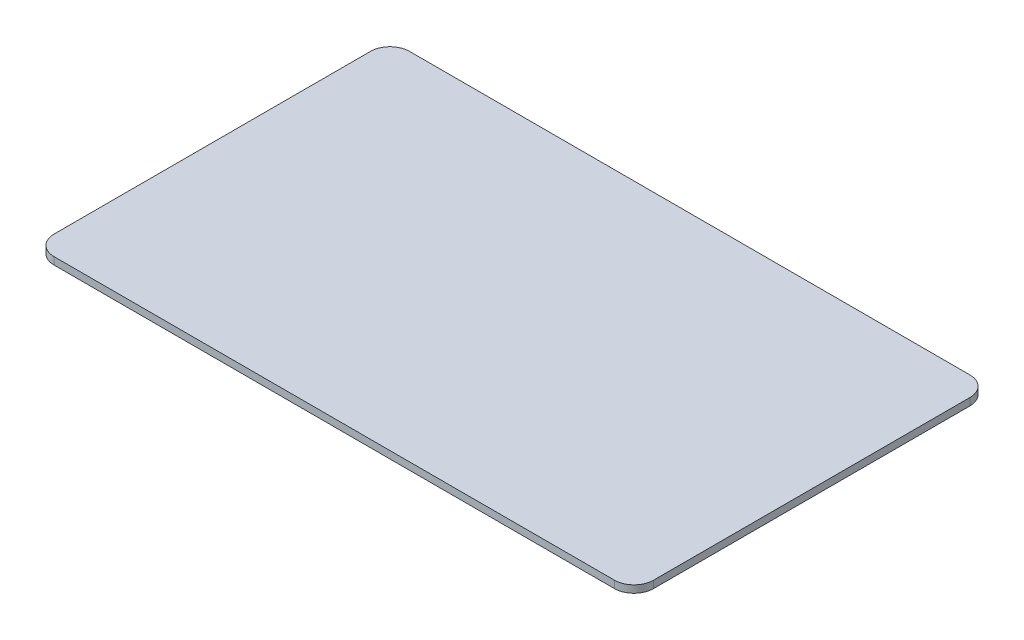
ISO-10303-21;
HEADER;
FILE_DESCRIPTION(('STEP AP214'),'2;1');
FILE_NAME('part.step','',(''),(''),'','','');
FILE_SCHEMA(('AUTOMOTIVE_DESIGN { 1 0 10303 214 1 1 1 1 }'));
ENDSEC;
DATA;
#1=APPLICATION_CONTEXT('core data for automotive mechanical design processes');
#2=APPLICATION_PROTOCOL_DEFINITION('international standard','automotive_design',2000,#1);
#3=PRODUCT_CONTEXT('',#1,'mechanical');
#4=PRODUCT('Part','Part','',(#3));
#5=PRODUCT_RELATED_PRODUCT_CATEGORY('part','',(#4));
#6=PRODUCT_DEFINITION_FORMATION('','',#4);
#7=PRODUCT_DEFINITION_CONTEXT('part definition',#1,'design');
#8=PRODUCT_DEFINITION('design','',#6,#7);
#9=PRODUCT_DEFINITION_SHAPE('','',#8);
#10=(LENGTH_UNIT() NAMED_UNIT(*) SI_UNIT(.MILLI.,.METRE.));
#11=(NAMED_UNIT(*) PLANE_ANGLE_UNIT() SI_UNIT($,.RADIAN.));
#12=(NAMED_UNIT(*) SI_UNIT($,.STERADIAN.) SOLID_ANGLE_UNIT());
#13=UNCERTAINTY_MEASURE_WITH_UNIT(LENGTH_MEASURE(1.E-05),#10,'distance_accuracy_value','');
#14=(GEOMETRIC_REPRESENTATION_CONTEXT(3) GLOBAL_UNCERTAINTY_ASSIGNED_CONTEXT((#13)) GLOBAL_UNIT_ASSIGNED_CONTEXT((#10,
#11,#12)) REPRESENTATION_CONTEXT('',''));
#15=CARTESIAN_POINT('',(0.,0.,0.));
#16=DIRECTION('',(0.,0.,1.));
#17=DIRECTION('',(1.,0.,0.));
#18=AXIS2_PLACEMENT_3D('',#15,#16,#17);
#19=CARTESIAN_POINT('',(-114.85,1.5,64.85));
#20=DIRECTION('',(0.,-1.,0.));
#21=DIRECTION('',(0.,0.,-1.));
#22=AXIS2_PLACEMENT_3D('',#19,#20,#21);
#23=CYLINDRICAL_SURFACE('',#22,7.99999999999999);
#24=CARTESIAN_POINT('',(-114.85,-1.5,64.85));
#25=DIRECTION('',(0.,1.,0.));
#26=DIRECTION('',(0.,0.,-1.));
#27=AXIS2_PLACEMENT_3D('',#24,#25,#26);
#28=CIRCLE('',#27,7.99999999999999);
#29=CARTESIAN_POINT('',(-122.85,-1.5,64.8499999999999));
#30=VERTEX_POINT('',#29);
#31=CARTESIAN_POINT('',(-114.85,-1.5,72.85));
#32=VERTEX_POINT('',#31);
#33=EDGE_CURVE('E129',#30,#32,#28,.T.);
#34=ORIENTED_EDGE('',*,*,#33,.T.);
#35=DIRECTION('',(0.,-1.,0.));
#36=VECTOR('',#35,1.);
#37=CARTESIAN_POINT('',(-114.85,1.5,72.85));
#38=LINE('',#37,#36);
#39=CARTESIAN_POINT('',(-114.85,1.5,72.85));
#40=VERTEX_POINT('',#39);
#41=EDGE_CURVE('E11',#40,#32,#38,.T.);
#42=ORIENTED_EDGE('',*,*,#41,.F.);
#43=CARTESIAN_POINT('',(-114.85,1.5,64.85));
#44=DIRECTION('',(0.,1.,0.));
#45=DIRECTION('',(0.,0.,-1.));
#46=AXIS2_PLACEMENT_3D('',#43,#44,#45);
#47=CIRCLE('',#46,7.99999999999999);
#48=CARTESIAN_POINT('',(-122.85,1.5,64.8499999999999));
#49=VERTEX_POINT('',#48);
#50=EDGE_CURVE('E143',#49,#40,#47,.T.);
#51=ORIENTED_EDGE('',*,*,#50,.F.);
#52=DIRECTION('',(0.,-1.,0.));
#53=VECTOR('',#52,1.);
#54=CARTESIAN_POINT('',(-122.85,1.5,64.8499999999999));
#55=LINE('',#54,#53);
#56=EDGE_CURVE('E125',#49,#30,#55,.T.);
#57=ORIENTED_EDGE('',*,*,#56,.T.);
#58=EDGE_LOOP('',(#34,#42,#51,#57));
#59=FACE_BOUND('',#58,.T.);
#60=ADVANCED_FACE('F33',(#59),#23,.T.);
#61=CARTESIAN_POINT('',(-114.85,1.5,72.85));
#62=DIRECTION('',(0.,0.,-1.));
#63=DIRECTION('',(-1.,0.,0.));
#64=AXIS2_PLACEMENT_3D('',#61,#62,#63);
#65=PLANE('',#64);
#66=DIRECTION('',(1.,0.,0.));
#67=VECTOR('',#66,1.);
#68=CARTESIAN_POINT('',(-114.85,-1.5,72.85));
#69=LINE('',#68,#67);
#70=CARTESIAN_POINT('',(114.85,-1.5,72.85));
#71=VERTEX_POINT('',#70);
#72=EDGE_CURVE('E132',#32,#71,#69,.T.);
#73=ORIENTED_EDGE('',*,*,#72,.T.);
#74=DIRECTION('',(0.,-1.,0.));
#75=VECTOR('',#74,1.);
#76=CARTESIAN_POINT('',(114.85,1.5,72.85));
#77=LINE('',#76,#75);
#78=CARTESIAN_POINT('',(114.85,1.5,72.85));
#79=VERTEX_POINT('',#78);
#80=EDGE_CURVE('E41',#79,#71,#77,.T.);
#81=ORIENTED_EDGE('',*,*,#80,.F.);
#82=DIRECTION('',(1.,0.,0.));
#83=VECTOR('',#82,1.);
#84=CARTESIAN_POINT('',(-114.85,1.5,72.85));
#85=LINE('',#84,#83);
#86=EDGE_CURVE('E92',#40,#79,#85,.T.);
#87=ORIENTED_EDGE('',*,*,#86,.F.);
#88=ORIENTED_EDGE('',*,*,#41,.T.);
#89=EDGE_LOOP('',(#73,#81,#87,#88));
#90=FACE_BOUND('',#89,.T.);
#91=ADVANCED_FACE('F178',(#90),#65,.F.);
#92=CARTESIAN_POINT('',(114.85,1.5,64.85));
#93=DIRECTION('',(0.,-1.,0.));
#94=DIRECTION('',(0.,0.,-1.));
#95=AXIS2_PLACEMENT_3D('',#92,#93,#94);
#96=CYLINDRICAL_SURFACE('',#95,7.99999999999999);
#97=CARTESIAN_POINT('',(114.85,-1.5,64.85));
#98=DIRECTION('',(0.,1.,0.));
#99=DIRECTION('',(0.,0.,1.));
#100=AXIS2_PLACEMENT_3D('',#97,#98,#99);
#101=CIRCLE('',#100,7.99999999999999);
#102=CARTESIAN_POINT('',(122.85,-1.5,64.8499999999999));
#103=VERTEX_POINT('',#102);
#104=EDGE_CURVE('E134',#71,#103,#101,.T.);
#105=ORIENTED_EDGE('',*,*,#104,.T.);
#106=DIRECTION('',(0.,-1.,0.));
#107=VECTOR('',#106,1.);
#108=CARTESIAN_POINT('',(122.85,1.5,64.8499999999999));
#109=LINE('',#108,#107);
#110=CARTESIAN_POINT('',(122.85,1.5,64.8499999999999));
#111=VERTEX_POINT('',#110);
#112=EDGE_CURVE('E150',#111,#103,#109,.T.);
#113=ORIENTED_EDGE('',*,*,#112,.F.);
#114=CARTESIAN_POINT('',(114.85,1.5,64.85));
#115=DIRECTION('',(0.,1.,0.));
#116=DIRECTION('',(0.,0.,1.));
#117=AXIS2_PLACEMENT_3D('',#114,#115,#116);
#118=CIRCLE('',#117,7.99999999999999);
#119=EDGE_CURVE('E158',#79,#111,#118,.T.);
#120=ORIENTED_EDGE('',*,*,#119,.F.);
#121=ORIENTED_EDGE('',*,*,#80,.T.);
#122=EDGE_LOOP('',(#105,#113,#120,#121));
#123=FACE_BOUND('',#122,.T.);
#124=ADVANCED_FACE('F156',(#123),#96,.T.);
#125=CARTESIAN_POINT('',(122.85,1.5,64.8499999999999));
#126=DIRECTION('',(-1.,0.,0.));
#127=DIRECTION('',(0.,0.,1.));
#128=AXIS2_PLACEMENT_3D('',#125,#126,#127);
#129=PLANE('',#128);
#130=DIRECTION('',(0.,0.,-1.));
#131=VECTOR('',#130,1.);
#132=CARTESIAN_POINT('',(122.85,-1.5,64.8499999999999));
#133=LINE('',#132,#131);
#134=CARTESIAN_POINT('',(122.85,-1.5,-64.85));
#135=VERTEX_POINT('',#134);
#136=EDGE_CURVE('E136',#103,#135,#133,.T.);
#137=ORIENTED_EDGE('',*,*,#136,.T.);
#138=DIRECTION('',(0.,-1.,0.));
#139=VECTOR('',#138,1.);
#140=CARTESIAN_POINT('',(122.85,1.5,-64.85));
#141=LINE('',#140,#139);
#142=CARTESIAN_POINT('',(122.85,1.5,-64.85));
#143=VERTEX_POINT('',#142);
#144=EDGE_CURVE('E147',#143,#135,#141,.T.);
#145=ORIENTED_EDGE('',*,*,#144,.F.);
#146=DIRECTION('',(0.,0.,-1.));
#147=VECTOR('',#146,1.);
#148=CARTESIAN_POINT('',(122.85,1.5,64.8499999999999));
#149=LINE('',#148,#147);
#150=EDGE_CURVE('E170',#111,#143,#149,.T.);
#151=ORIENTED_EDGE('',*,*,#150,.F.);
#152=ORIENTED_EDGE('',*,*,#112,.T.);
#153=EDGE_LOOP('',(#137,#145,#151,#152));
#154=FACE_BOUND('',#153,.T.);
#155=ADVANCED_FACE('F166',(#154),#129,.F.);
#156=CARTESIAN_POINT('',(114.85,1.5,-64.85));
#157=DIRECTION('',(0.,-1.,0.));
#158=DIRECTION('',(0.,0.,-1.));
#159=AXIS2_PLACEMENT_3D('',#156,#157,#158);
#160=CYLINDRICAL_SURFACE('',#159,7.99999999999999);
#161=CARTESIAN_POINT('',(114.85,-1.5,-64.85));
#162=DIRECTION('',(0.,1.,0.));
#163=DIRECTION('',(0.,0.,-1.));
#164=AXIS2_PLACEMENT_3D('',#161,#162,#163);
#165=CIRCLE('',#164,7.99999999999999);
#166=CARTESIAN_POINT('',(114.85,-1.5,-72.85));
#167=VERTEX_POINT('',#166);
#168=EDGE_CURVE('E138',#135,#167,#165,.T.);
#169=ORIENTED_EDGE('',*,*,#168,.T.);
#170=DIRECTION('',(0.,-1.,0.));
#171=VECTOR('',#170,1.);
#172=CARTESIAN_POINT('',(114.85,1.5,-72.85));
#173=LINE('',#172,#171);
#174=CARTESIAN_POINT('',(114.85,1.5,-72.85));
#175=VERTEX_POINT('',#174);
#176=EDGE_CURVE('E120',#175,#167,#173,.T.);
#177=ORIENTED_EDGE('',*,*,#176,.F.);
#178=CARTESIAN_POINT('',(114.85,1.5,-64.85));
#179=DIRECTION('',(0.,1.,0.));
#180=DIRECTION('',(0.,0.,-1.));
#181=AXIS2_PLACEMENT_3D('',#178,#179,#180);
#182=CIRCLE('',#181,7.99999999999999);
#183=EDGE_CURVE('E111',#143,#175,#182,.T.);
#184=ORIENTED_EDGE('',*,*,#183,.F.);
#185=ORIENTED_EDGE('',*,*,#144,.T.);
#186=EDGE_LOOP('',(#169,#177,#184,#185));
#187=FACE_BOUND('',#186,.T.);
#188=ADVANCED_FACE('F169',(#187),#160,.T.);
#189=CARTESIAN_POINT('',(-114.85,1.5,-72.85));
#190=DIRECTION('',(0.,0.,1.));
#191=DIRECTION('',(1.,0.,0.));
#192=AXIS2_PLACEMENT_3D('',#189,#190,#191);
#193=PLANE('',#192);
#194=DIRECTION('',(-1.,0.,0.));
#195=VECTOR('',#194,1.);
#196=CARTESIAN_POINT('',(-114.85,-1.5,-72.85));
#197=LINE('',#196,#195);
#198=CARTESIAN_POINT('',(-114.85,-1.5,-72.85));
#199=VERTEX_POINT('',#198);
#200=EDGE_CURVE('E119',#167,#199,#197,.T.);
#201=ORIENTED_EDGE('',*,*,#200,.T.);
#202=DIRECTION('',(0.,-1.,0.));
#203=VECTOR('',#202,1.);
#204=CARTESIAN_POINT('',(-114.85,1.5,-72.85));
#205=LINE('',#204,#203);
#206=CARTESIAN_POINT('',(-114.85,1.5,-72.85));
#207=VERTEX_POINT('',#206);
#208=EDGE_CURVE('E116',#207,#199,#205,.T.);
#209=ORIENTED_EDGE('',*,*,#208,.F.);
#210=DIRECTION('',(-1.,0.,0.));
#211=VECTOR('',#210,1.);
#212=CARTESIAN_POINT('',(-114.85,1.5,-72.85));
#213=LINE('',#212,#211);
#214=EDGE_CURVE('E105',#175,#207,#213,.T.);
#215=ORIENTED_EDGE('',*,*,#214,.F.);
#216=ORIENTED_EDGE('',*,*,#176,.T.);
#217=EDGE_LOOP('',(#201,#209,#215,#216));
#218=FACE_BOUND('',#217,.T.);
#219=ADVANCED_FACE('F117',(#218),#193,.F.);
#220=CARTESIAN_POINT('',(-114.85,1.5,-64.85));
#221=DIRECTION('',(0.,-1.,0.));
#222=DIRECTION('',(0.,0.,-1.));
#223=AXIS2_PLACEMENT_3D('',#220,#221,#222);
#224=CYLINDRICAL_SURFACE('',#223,7.99999999999999);
#225=CARTESIAN_POINT('',(-114.85,-1.5,-64.85));
#226=DIRECTION('',(0.,1.,0.));
#227=DIRECTION('',(0.,0.,-1.));
#228=AXIS2_PLACEMENT_3D('',#225,#226,#227);
#229=CIRCLE('',#228,7.99999999999999);
#230=CARTESIAN_POINT('',(-122.85,-1.5,-64.85));
#231=VERTEX_POINT('',#230);
#232=EDGE_CURVE('E78',#199,#231,#229,.T.);
#233=ORIENTED_EDGE('',*,*,#232,.T.);
#234=DIRECTION('',(0.,-1.,0.));
#235=VECTOR('',#234,1.);
#236=CARTESIAN_POINT('',(-122.85,1.5,-64.85));
#237=LINE('',#236,#235);
#238=CARTESIAN_POINT('',(-122.85,1.5,-64.85));
#239=VERTEX_POINT('',#238);
#240=EDGE_CURVE('E121',#239,#231,#237,.T.);
#241=ORIENTED_EDGE('',*,*,#240,.F.);
#242=CARTESIAN_POINT('',(-114.85,1.5,-64.85));
#243=DIRECTION('',(0.,1.,0.));
#244=DIRECTION('',(0.,0.,-1.));
#245=AXIS2_PLACEMENT_3D('',#242,#243,#244);
#246=CIRCLE('',#245,7.99999999999999);
#247=EDGE_CURVE('E109',#207,#239,#246,.T.);
#248=ORIENTED_EDGE('',*,*,#247,.F.);
#249=ORIENTED_EDGE('',*,*,#208,.T.);
#250=EDGE_LOOP('',(#233,#241,#248,#249));
#251=FACE_BOUND('',#250,.T.);
#252=ADVANCED_FACE('F123',(#251),#224,.T.);
#253=CARTESIAN_POINT('',(-122.85,1.5,64.8499999999999));
#254=DIRECTION('',(1.,0.,0.));
#255=DIRECTION('',(0.,0.,-1.));
#256=AXIS2_PLACEMENT_3D('',#253,#254,#255);
#257=PLANE('',#256);
#258=DIRECTION('',(0.,0.,1.));
#259=VECTOR('',#258,1.);
#260=CARTESIAN_POINT('',(-122.85,-1.5,64.8499999999999));
#261=LINE('',#260,#259);
#262=EDGE_CURVE('E84',#231,#30,#261,.T.);
#263=ORIENTED_EDGE('',*,*,#262,.T.);
#264=ORIENTED_EDGE('',*,*,#56,.F.);
#265=DIRECTION('',(0.,0.,1.));
#266=VECTOR('',#265,1.);
#267=CARTESIAN_POINT('',(-122.85,1.5,64.8499999999999));
#268=LINE('',#267,#266);
#269=EDGE_CURVE('E49',#239,#49,#268,.T.);
#270=ORIENTED_EDGE('',*,*,#269,.F.);
#271=ORIENTED_EDGE('',*,*,#240,.T.);
#272=EDGE_LOOP('',(#263,#264,#270,#271));
#273=FACE_BOUND('',#272,.T.);
#274=ADVANCED_FACE('F194',(#273),#257,.F.);
#275=CARTESIAN_POINT('',(-114.85,1.5,64.85));
#276=DIRECTION('',(0.,-1.,0.));
#277=DIRECTION('',(0.,0.,-1.));
#278=AXIS2_PLACEMENT_3D('',#275,#276,#277);
#279=PLANE('',#278);
#280=ORIENTED_EDGE('',*,*,#50,.T.);
#281=ORIENTED_EDGE('',*,*,#86,.T.);
#282=ORIENTED_EDGE('',*,*,#119,.T.);
#283=ORIENTED_EDGE('',*,*,#150,.T.);
#284=ORIENTED_EDGE('',*,*,#183,.T.);
#285=ORIENTED_EDGE('',*,*,#214,.T.);
#286=ORIENTED_EDGE('',*,*,#247,.T.);
#287=ORIENTED_EDGE('',*,*,#269,.T.);
#288=EDGE_LOOP('',(#280,#281,#282,#283,#284,#285,#286,#287));
#289=FACE_BOUND('',#288,.T.);
#290=ADVANCED_FACE('F107',(#289),#279,.F.);
#291=CARTESIAN_POINT('',(-114.85,-1.5,64.85));
#292=DIRECTION('',(0.,-1.,0.));
#293=DIRECTION('',(0.,0.,-1.));
#294=AXIS2_PLACEMENT_3D('',#291,#292,#293);
#295=PLANE('',#294);
#296=ORIENTED_EDGE('',*,*,#33,.F.);
#297=ORIENTED_EDGE('',*,*,#262,.F.);
#298=ORIENTED_EDGE('',*,*,#232,.F.);
#299=ORIENTED_EDGE('',*,*,#200,.F.);
#300=ORIENTED_EDGE('',*,*,#168,.F.);
#301=ORIENTED_EDGE('',*,*,#136,.F.);
#302=ORIENTED_EDGE('',*,*,#104,.F.);
#303=ORIENTED_EDGE('',*,*,#72,.F.);
#304=EDGE_LOOP('',(#296,#297,#298,#299,#300,#301,#302,#303));
#305=FACE_BOUND('',#304,.T.);
#306=ADVANCED_FACE('F162',(#305),#295,.T.);
#307=CLOSED_SHELL('',(#60,#91,#124,#155,#188,#219,#252,#274,#290,#306));
#308=MANIFOLD_SOLID_BREP('B2',#307);
#309=ADVANCED_BREP_SHAPE_REPRESENTATION('',(#18,#308),#14);
#310=SHAPE_DEFINITION_REPRESENTATION(#9,#309);
ENDSEC;
END-ISO-10303-21;
